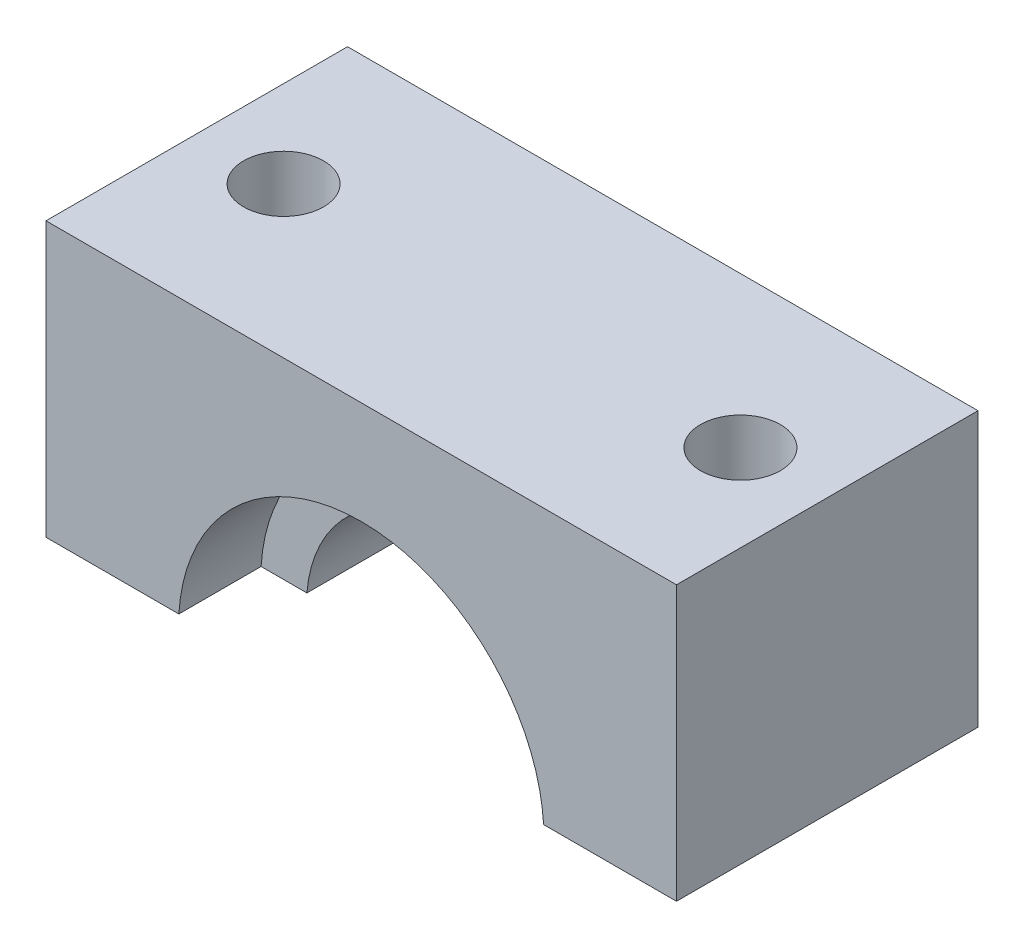
ISO-10303-21;
HEADER;
FILE_DESCRIPTION(('STEP AP214'),'2;1');
FILE_NAME('part.step','',(''),(''),'','','');
FILE_SCHEMA(('AUTOMOTIVE_DESIGN { 1 0 10303 214 1 1 1 1 }'));
ENDSEC;
DATA;
#1=APPLICATION_CONTEXT('core data for automotive mechanical design processes');
#2=APPLICATION_PROTOCOL_DEFINITION('international standard','automotive_design',2000,#1);
#3=PRODUCT_CONTEXT('',#1,'mechanical');
#4=PRODUCT('Part','Part','',(#3));
#5=PRODUCT_RELATED_PRODUCT_CATEGORY('part','',(#4));
#6=PRODUCT_DEFINITION_FORMATION('','',#4);
#7=PRODUCT_DEFINITION_CONTEXT('part definition',#1,'design');
#8=PRODUCT_DEFINITION('design','',#6,#7);
#9=PRODUCT_DEFINITION_SHAPE('','',#8);
#10=(LENGTH_UNIT() NAMED_UNIT(*) SI_UNIT(.MILLI.,.METRE.));
#11=(NAMED_UNIT(*) PLANE_ANGLE_UNIT() SI_UNIT($,.RADIAN.));
#12=(NAMED_UNIT(*) SI_UNIT($,.STERADIAN.) SOLID_ANGLE_UNIT());
#13=UNCERTAINTY_MEASURE_WITH_UNIT(LENGTH_MEASURE(1.E-05),#10,'distance_accuracy_value','');
#14=(GEOMETRIC_REPRESENTATION_CONTEXT(3) GLOBAL_UNCERTAINTY_ASSIGNED_CONTEXT((#13)) GLOBAL_UNIT_ASSIGNED_CONTEXT((#10,
#11,#12)) REPRESENTATION_CONTEXT('',''));
#15=CARTESIAN_POINT('',(0.,0.,0.));
#16=DIRECTION('',(0.,0.,1.));
#17=DIRECTION('',(1.,0.,0.));
#18=AXIS2_PLACEMENT_3D('',#15,#16,#17);
#19=CARTESIAN_POINT('',(0.,-6.5,3.));
#20=DIRECTION('',(0.,0.,1.));
#21=DIRECTION('',(1.,0.,0.));
#22=AXIS2_PLACEMENT_3D('',#19,#20,#21);
#23=PLANE('',#22);
#24=DIRECTION('',(1.,0.,0.));
#25=VECTOR('',#24,1.);
#26=CARTESIAN_POINT('',(5.9791303715507,-6.,3.));
#27=LINE('',#26,#25);
#28=CARTESIAN_POINT('',(5.9791303715507,-6.,3.));
#29=VERTEX_POINT('',#28);
#30=CARTESIAN_POINT('',(7.98435971133565,-6.,3.));
#31=VERTEX_POINT('',#30);
#32=EDGE_CURVE('E53',#29,#31,#27,.T.);
#33=ORIENTED_EDGE('',*,*,#32,.T.);
#34=CARTESIAN_POINT('',(0.,-6.5,3.));
#35=DIRECTION('',(0.,0.,1.));
#36=DIRECTION('',(1.,0.,0.));
#37=AXIS2_PLACEMENT_3D('',#34,#35,#36);
#38=CIRCLE('',#37,8.);
#39=CARTESIAN_POINT('',(-7.98435971133565,-6.,3.));
#40=VERTEX_POINT('',#39);
#41=EDGE_CURVE('E48',#31,#40,#38,.T.);
#42=ORIENTED_EDGE('',*,*,#41,.T.);
#43=DIRECTION('',(1.,0.,0.));
#44=VECTOR('',#43,1.);
#45=CARTESIAN_POINT('',(-13.8,-6.,3.));
#46=LINE('',#45,#44);
#47=CARTESIAN_POINT('',(-5.9791303715507,-6.,3.));
#48=VERTEX_POINT('',#47);
#49=EDGE_CURVE('E173',#40,#48,#46,.T.);
#50=ORIENTED_EDGE('',*,*,#49,.T.);
#51=CARTESIAN_POINT('',(0.,-6.5,3.));
#52=DIRECTION('',(0.,0.,-1.));
#53=DIRECTION('',(1.,0.,0.));
#54=AXIS2_PLACEMENT_3D('',#51,#52,#53);
#55=CIRCLE('',#54,6.);
#56=EDGE_CURVE('E169',#48,#29,#55,.T.);
#57=ORIENTED_EDGE('',*,*,#56,.T.);
#58=EDGE_LOOP('',(#33,#42,#50,#57));
#59=FACE_BOUND('',#58,.T.);
#60=ADVANCED_FACE('F33',(#59),#23,.T.);
#61=CARTESIAN_POINT('',(0.,-6.5,-3.));
#62=DIRECTION('',(0.,0.,1.));
#63=DIRECTION('',(1.,0.,0.));
#64=AXIS2_PLACEMENT_3D('',#61,#62,#63);
#65=PLANE('',#64);
#66=CARTESIAN_POINT('',(0.,-6.5,-3.));
#67=DIRECTION('',(0.,0.,1.));
#68=DIRECTION('',(1.,0.,0.));
#69=AXIS2_PLACEMENT_3D('',#66,#67,#68);
#70=CIRCLE('',#69,8.);
#71=CARTESIAN_POINT('',(7.98435971133565,-6.,-3.));
#72=VERTEX_POINT('',#71);
#73=CARTESIAN_POINT('',(-7.98435971133565,-6.,-3.));
#74=VERTEX_POINT('',#73);
#75=EDGE_CURVE('E11',#72,#74,#70,.T.);
#76=ORIENTED_EDGE('',*,*,#75,.F.);
#77=DIRECTION('',(1.,0.,0.));
#78=VECTOR('',#77,1.);
#79=CARTESIAN_POINT('',(5.9791303715507,-6.,-3.));
#80=LINE('',#79,#78);
#81=CARTESIAN_POINT('',(5.9791303715507,-6.,-3.));
#82=VERTEX_POINT('',#81);
#83=EDGE_CURVE('E178',#82,#72,#80,.T.);
#84=ORIENTED_EDGE('',*,*,#83,.F.);
#85=CARTESIAN_POINT('',(0.,-6.5,-3.));
#86=DIRECTION('',(0.,0.,-1.));
#87=DIRECTION('',(1.,0.,0.));
#88=AXIS2_PLACEMENT_3D('',#85,#86,#87);
#89=CIRCLE('',#88,6.);
#90=CARTESIAN_POINT('',(-5.9791303715507,-6.,-3.));
#91=VERTEX_POINT('',#90);
#92=EDGE_CURVE('E168',#91,#82,#89,.T.);
#93=ORIENTED_EDGE('',*,*,#92,.F.);
#94=DIRECTION('',(1.,0.,0.));
#95=VECTOR('',#94,1.);
#96=CARTESIAN_POINT('',(-13.8,-6.,-3.));
#97=LINE('',#96,#95);
#98=EDGE_CURVE('E171',#74,#91,#97,.T.);
#99=ORIENTED_EDGE('',*,*,#98,.F.);
#100=EDGE_LOOP('',(#76,#84,#93,#99));
#101=FACE_BOUND('',#100,.T.);
#102=ADVANCED_FACE('F198',(#101),#65,.F.);
#103=CARTESIAN_POINT('',(0.,-6.5,3.));
#104=DIRECTION('',(0.,0.,-1.));
#105=DIRECTION('',(-1.,0.,0.));
#106=AXIS2_PLACEMENT_3D('',#103,#104,#105);
#107=CYLINDRICAL_SURFACE('',#106,6.);
#108=ORIENTED_EDGE('',*,*,#92,.T.);
#109=DIRECTION('',(0.,0.,-1.));
#110=VECTOR('',#109,1.);
#111=CARTESIAN_POINT('',(5.9791303715507,-6.,3.));
#112=LINE('',#111,#110);
#113=EDGE_CURVE('E41',#29,#82,#112,.T.);
#114=ORIENTED_EDGE('',*,*,#113,.F.);
#115=ORIENTED_EDGE('',*,*,#56,.F.);
#116=DIRECTION('',(0.,0.,-1.));
#117=VECTOR('',#116,1.);
#118=CARTESIAN_POINT('',(-5.9791303715507,-6.,3.));
#119=LINE('',#118,#117);
#120=EDGE_CURVE('E175',#48,#91,#119,.T.);
#121=ORIENTED_EDGE('',*,*,#120,.T.);
#122=EDGE_LOOP('',(#108,#114,#115,#121));
#123=FACE_BOUND('',#122,.T.);
#124=ADVANCED_FACE('F35',(#123),#107,.F.);
#125=CARTESIAN_POINT('',(5.9791303715507,-6.,3.));
#126=DIRECTION('',(0.,1.,0.));
#127=DIRECTION('',(-1.,0.,0.));
#128=AXIS2_PLACEMENT_3D('',#125,#126,#127);
#129=PLANE('',#128);
#130=CARTESIAN_POINT('',(10.,-5.99999999999999,0.));
#131=DIRECTION('',(0.,-1.,0.));
#132=DIRECTION('',(1.,0.,0.));
#133=AXIS2_PLACEMENT_3D('',#130,#131,#132);
#134=CIRCLE('',#133,1.75);
#135=CARTESIAN_POINT('',(11.75,-5.99999999999999,0.));
#136=VERTEX_POINT('',#135);
#137=EDGE_CURVE('E243',#136,#136,#134,.T.);
#138=ORIENTED_EDGE('',*,*,#137,.F.);
#139=EDGE_LOOP('',(#138));
#140=FACE_BOUND('',#139,.T.);
#141=DIRECTION('',(0.,0.,-1.));
#142=VECTOR('',#141,1.);
#143=CARTESIAN_POINT('',(13.8,-5.99999999999999,3.));
#144=LINE('',#143,#142);
#145=CARTESIAN_POINT('',(13.8,-5.99999999999999,6.6));
#146=VERTEX_POINT('',#145);
#147=CARTESIAN_POINT('',(13.8,-5.99999999999999,-6.6));
#148=VERTEX_POINT('',#147);
#149=EDGE_CURVE('E117',#146,#148,#144,.T.);
#150=ORIENTED_EDGE('',*,*,#149,.F.);
#151=DIRECTION('',(1.,0.,0.));
#152=VECTOR('',#151,1.);
#153=CARTESIAN_POINT('',(13.8,-5.99999999999999,6.6));
#154=LINE('',#153,#152);
#155=CARTESIAN_POINT('',(7.98435971133565,-6.,6.6));
#156=VERTEX_POINT('',#155);
#157=EDGE_CURVE('E131',#156,#146,#154,.T.);
#158=ORIENTED_EDGE('',*,*,#157,.F.);
#159=DIRECTION('',(0.,0.,-1.));
#160=VECTOR('',#159,1.);
#161=CARTESIAN_POINT('',(7.98435971133565,-6.,6.6));
#162=LINE('',#161,#160);
#163=EDGE_CURVE('E160',#156,#31,#162,.T.);
#164=ORIENTED_EDGE('',*,*,#163,.T.);
#165=ORIENTED_EDGE('',*,*,#32,.F.);
#166=ORIENTED_EDGE('',*,*,#113,.T.);
#167=ORIENTED_EDGE('',*,*,#83,.T.);
#168=CARTESIAN_POINT('',(7.98435971133565,-6.,-6.6));
#169=VERTEX_POINT('',#168);
#170=EDGE_CURVE('E147',#72,#169,#162,.T.);
#171=ORIENTED_EDGE('',*,*,#170,.T.);
#172=DIRECTION('',(1.,0.,0.));
#173=VECTOR('',#172,1.);
#174=CARTESIAN_POINT('',(13.8,-5.99999999999999,-6.6));
#175=LINE('',#174,#173);
#176=EDGE_CURVE('E132',#169,#148,#175,.T.);
#177=ORIENTED_EDGE('',*,*,#176,.T.);
#178=EDGE_LOOP('',(#150,#158,#164,#165,#166,#167,#171,#177));
#179=FACE_BOUND('',#178,.T.);
#180=ADVANCED_FACE('F190',(#140,#179),#129,.F.);
#181=CARTESIAN_POINT('',(13.8,6.00000000000001,3.));
#182=DIRECTION('',(-1.,0.,0.));
#183=DIRECTION('',(0.,-1.,0.));
#184=AXIS2_PLACEMENT_3D('',#181,#182,#183);
#185=PLANE('',#184);
#186=ORIENTED_EDGE('',*,*,#149,.T.);
#187=DIRECTION('',(0.,1.,0.));
#188=VECTOR('',#187,1.);
#189=CARTESIAN_POINT('',(13.8,-5.99999999999999,-6.6));
#190=LINE('',#189,#188);
#191=CARTESIAN_POINT('',(13.8,6.00000000000001,-6.6));
#192=VERTEX_POINT('',#191);
#193=EDGE_CURVE('E113',#148,#192,#190,.T.);
#194=ORIENTED_EDGE('',*,*,#193,.T.);
#195=DIRECTION('',(0.,0.,-1.));
#196=VECTOR('',#195,1.);
#197=CARTESIAN_POINT('',(13.8,6.00000000000001,3.));
#198=LINE('',#197,#196);
#199=CARTESIAN_POINT('',(13.8,6.00000000000001,6.6));
#200=VERTEX_POINT('',#199);
#201=EDGE_CURVE('E107',#200,#192,#198,.T.);
#202=ORIENTED_EDGE('',*,*,#201,.F.);
#203=DIRECTION('',(0.,1.,0.));
#204=VECTOR('',#203,1.);
#205=CARTESIAN_POINT('',(13.8,-5.99999999999999,6.6));
#206=LINE('',#205,#204);
#207=EDGE_CURVE('E111',#146,#200,#206,.T.);
#208=ORIENTED_EDGE('',*,*,#207,.F.);
#209=EDGE_LOOP('',(#186,#194,#202,#208));
#210=FACE_BOUND('',#209,.T.);
#211=ADVANCED_FACE('F109',(#210),#185,.F.);
#212=CARTESIAN_POINT('',(-13.8,6.,3.));
#213=DIRECTION('',(0.,-1.,0.));
#214=DIRECTION('',(1.,0.,0.));
#215=AXIS2_PLACEMENT_3D('',#212,#213,#214);
#216=PLANE('',#215);
#217=CARTESIAN_POINT('',(10.,6.00000000000001,0.));
#218=DIRECTION('',(0.,-1.,0.));
#219=DIRECTION('',(1.,0.,0.));
#220=AXIS2_PLACEMENT_3D('',#217,#218,#219);
#221=CIRCLE('',#220,1.75);
#222=CARTESIAN_POINT('',(11.75,6.00000000000001,0.));
#223=VERTEX_POINT('',#222);
#224=EDGE_CURVE('E245',#223,#223,#221,.T.);
#225=ORIENTED_EDGE('',*,*,#224,.T.);
#226=EDGE_LOOP('',(#225));
#227=FACE_BOUND('',#226,.T.);
#228=CARTESIAN_POINT('',(-10.,6.00000000000001,0.));
#229=DIRECTION('',(0.,-1.,0.));
#230=DIRECTION('',(1.,0.,0.));
#231=AXIS2_PLACEMENT_3D('',#228,#229,#230);
#232=CIRCLE('',#231,1.75);
#233=CARTESIAN_POINT('',(-8.25,6.00000000000001,0.));
#234=VERTEX_POINT('',#233);
#235=EDGE_CURVE('E150',#234,#234,#232,.T.);
#236=ORIENTED_EDGE('',*,*,#235,.T.);
#237=EDGE_LOOP('',(#236));
#238=FACE_BOUND('',#237,.T.);
#239=ORIENTED_EDGE('',*,*,#201,.T.);
#240=DIRECTION('',(-1.,0.,0.));
#241=VECTOR('',#240,1.);
#242=CARTESIAN_POINT('',(13.8,6.00000000000001,-6.6));
#243=LINE('',#242,#241);
#244=CARTESIAN_POINT('',(-13.8,6.,-6.6));
#245=VERTEX_POINT('',#244);
#246=EDGE_CURVE('E149',#192,#245,#243,.T.);
#247=ORIENTED_EDGE('',*,*,#246,.T.);
#248=DIRECTION('',(0.,0.,-1.));
#249=VECTOR('',#248,1.);
#250=CARTESIAN_POINT('',(-13.8,6.,3.));
#251=LINE('',#250,#249);
#252=CARTESIAN_POINT('',(-13.8,6.,6.6));
#253=VERTEX_POINT('',#252);
#254=EDGE_CURVE('E118',#253,#245,#251,.T.);
#255=ORIENTED_EDGE('',*,*,#254,.F.);
#256=DIRECTION('',(-1.,0.,0.));
#257=VECTOR('',#256,1.);
#258=CARTESIAN_POINT('',(13.8,6.00000000000001,6.6));
#259=LINE('',#258,#257);
#260=EDGE_CURVE('E121',#200,#253,#259,.T.);
#261=ORIENTED_EDGE('',*,*,#260,.F.);
#262=EDGE_LOOP('',(#239,#247,#255,#261));
#263=FACE_BOUND('',#262,.T.);
#264=ADVANCED_FACE('F122',(#227,#238,#263),#216,.F.);
#265=CARTESIAN_POINT('',(-13.8,6.,3.));
#266=DIRECTION('',(1.,0.,0.));
#267=DIRECTION('',(0.,1.,0.));
#268=AXIS2_PLACEMENT_3D('',#265,#266,#267);
#269=PLANE('',#268);
#270=ORIENTED_EDGE('',*,*,#254,.T.);
#271=DIRECTION('',(0.,-1.,0.));
#272=VECTOR('',#271,1.);
#273=CARTESIAN_POINT('',(-13.8,6.,-6.6));
#274=LINE('',#273,#272);
#275=CARTESIAN_POINT('',(-13.8,-6.,-6.6));
#276=VERTEX_POINT('',#275);
#277=EDGE_CURVE('E152',#245,#276,#274,.T.);
#278=ORIENTED_EDGE('',*,*,#277,.T.);
#279=DIRECTION('',(0.,0.,-1.));
#280=VECTOR('',#279,1.);
#281=CARTESIAN_POINT('',(-13.8,-6.,3.));
#282=LINE('',#281,#280);
#283=CARTESIAN_POINT('',(-13.8,-6.,6.6));
#284=VERTEX_POINT('',#283);
#285=EDGE_CURVE('E184',#284,#276,#282,.T.);
#286=ORIENTED_EDGE('',*,*,#285,.F.);
#287=DIRECTION('',(0.,-1.,0.));
#288=VECTOR('',#287,1.);
#289=CARTESIAN_POINT('',(-13.8,6.,6.6));
#290=LINE('',#289,#288);
#291=EDGE_CURVE('E126',#253,#284,#290,.T.);
#292=ORIENTED_EDGE('',*,*,#291,.F.);
#293=EDGE_LOOP('',(#270,#278,#286,#292));
#294=FACE_BOUND('',#293,.T.);
#295=ADVANCED_FACE('F227',(#294),#269,.F.);
#296=CARTESIAN_POINT('',(-13.8,-6.,3.));
#297=DIRECTION('',(0.,1.,0.));
#298=DIRECTION('',(-1.,0.,0.));
#299=AXIS2_PLACEMENT_3D('',#296,#297,#298);
#300=PLANE('',#299);
#301=CARTESIAN_POINT('',(-10.,-6.,0.));
#302=DIRECTION('',(0.,-1.,0.));
#303=DIRECTION('',(1.,0.,0.));
#304=AXIS2_PLACEMENT_3D('',#301,#302,#303);
#305=CIRCLE('',#304,1.75);
#306=CARTESIAN_POINT('',(-8.25,-6.,0.));
#307=VERTEX_POINT('',#306);
#308=EDGE_CURVE('E138',#307,#307,#305,.T.);
#309=ORIENTED_EDGE('',*,*,#308,.F.);
#310=EDGE_LOOP('',(#309));
#311=FACE_BOUND('',#310,.T.);
#312=ORIENTED_EDGE('',*,*,#285,.T.);
#313=DIRECTION('',(1.,0.,0.));
#314=VECTOR('',#313,1.);
#315=CARTESIAN_POINT('',(-13.8,-6.,-6.6));
#316=LINE('',#315,#314);
#317=CARTESIAN_POINT('',(-7.98435971133565,-6.,-6.6));
#318=VERTEX_POINT('',#317);
#319=EDGE_CURVE('E155',#276,#318,#316,.T.);
#320=ORIENTED_EDGE('',*,*,#319,.T.);
#321=DIRECTION('',(0.,0.,-1.));
#322=VECTOR('',#321,1.);
#323=CARTESIAN_POINT('',(-7.98435971133565,-6.,6.6));
#324=LINE('',#323,#322);
#325=EDGE_CURVE('E163',#74,#318,#324,.T.);
#326=ORIENTED_EDGE('',*,*,#325,.F.);
#327=ORIENTED_EDGE('',*,*,#98,.T.);
#328=ORIENTED_EDGE('',*,*,#120,.F.);
#329=ORIENTED_EDGE('',*,*,#49,.F.);
#330=CARTESIAN_POINT('',(-7.98435971133565,-6.,6.6));
#331=VERTEX_POINT('',#330);
#332=EDGE_CURVE('E164',#331,#40,#324,.T.);
#333=ORIENTED_EDGE('',*,*,#332,.F.);
#334=DIRECTION('',(1.,0.,0.));
#335=VECTOR('',#334,1.);
#336=CARTESIAN_POINT('',(-13.8,-6.,6.6));
#337=LINE('',#336,#335);
#338=EDGE_CURVE('E142',#284,#331,#337,.T.);
#339=ORIENTED_EDGE('',*,*,#338,.F.);
#340=EDGE_LOOP('',(#312,#320,#326,#327,#328,#329,#333,#339));
#341=FACE_BOUND('',#340,.T.);
#342=ADVANCED_FACE('F203',(#311,#341),#300,.F.);
#343=CARTESIAN_POINT('',(0.,-6.5,-6.6));
#344=DIRECTION('',(0.,0.,-1.));
#345=DIRECTION('',(-1.,0.,0.));
#346=AXIS2_PLACEMENT_3D('',#343,#344,#345);
#347=PLANE('',#346);
#348=ORIENTED_EDGE('',*,*,#193,.F.);
#349=ORIENTED_EDGE('',*,*,#176,.F.);
#350=CARTESIAN_POINT('',(0.,-6.5,-6.6));
#351=DIRECTION('',(0.,0.,-1.));
#352=DIRECTION('',(-1.,0.,0.));
#353=AXIS2_PLACEMENT_3D('',#350,#351,#352);
#354=CIRCLE('',#353,8.);
#355=EDGE_CURVE('E135',#318,#169,#354,.T.);
#356=ORIENTED_EDGE('',*,*,#355,.F.);
#357=ORIENTED_EDGE('',*,*,#319,.F.);
#358=ORIENTED_EDGE('',*,*,#277,.F.);
#359=ORIENTED_EDGE('',*,*,#246,.F.);
#360=EDGE_LOOP('',(#348,#349,#356,#357,#358,#359));
#361=FACE_BOUND('',#360,.T.);
#362=ADVANCED_FACE('F210',(#361),#347,.T.);
#363=CARTESIAN_POINT('',(0.,-6.5,6.6));
#364=DIRECTION('',(0.,0.,-1.));
#365=DIRECTION('',(-1.,0.,0.));
#366=AXIS2_PLACEMENT_3D('',#363,#364,#365);
#367=CYLINDRICAL_SURFACE('',#366,8.);
#368=ORIENTED_EDGE('',*,*,#170,.F.);
#369=ORIENTED_EDGE('',*,*,#75,.T.);
#370=ORIENTED_EDGE('',*,*,#325,.T.);
#371=ORIENTED_EDGE('',*,*,#355,.T.);
#372=EDGE_LOOP('',(#368,#369,#370,#371));
#373=FACE_BOUND('',#372,.T.);
#374=ADVANCED_FACE('F201',(#373),#367,.F.);
#375=ORIENTED_EDGE('',*,*,#41,.F.);
#376=ORIENTED_EDGE('',*,*,#163,.F.);
#377=CARTESIAN_POINT('',(0.,-6.5,6.6));
#378=DIRECTION('',(0.,0.,-1.));
#379=DIRECTION('',(-1.,0.,0.));
#380=AXIS2_PLACEMENT_3D('',#377,#378,#379);
#381=CIRCLE('',#380,8.);
#382=EDGE_CURVE('E144',#331,#156,#381,.T.);
#383=ORIENTED_EDGE('',*,*,#382,.F.);
#384=ORIENTED_EDGE('',*,*,#332,.T.);
#385=EDGE_LOOP('',(#375,#376,#383,#384));
#386=FACE_BOUND('',#385,.T.);
#387=ADVANCED_FACE('F214',(#386),#367,.F.);
#388=CARTESIAN_POINT('',(0.,-6.5,6.6));
#389=DIRECTION('',(0.,0.,-1.));
#390=DIRECTION('',(-1.,0.,0.));
#391=AXIS2_PLACEMENT_3D('',#388,#389,#390);
#392=PLANE('',#391);
#393=ORIENTED_EDGE('',*,*,#207,.T.);
#394=ORIENTED_EDGE('',*,*,#260,.T.);
#395=ORIENTED_EDGE('',*,*,#291,.T.);
#396=ORIENTED_EDGE('',*,*,#338,.T.);
#397=ORIENTED_EDGE('',*,*,#382,.T.);
#398=ORIENTED_EDGE('',*,*,#157,.T.);
#399=EDGE_LOOP('',(#393,#394,#395,#396,#397,#398));
#400=FACE_BOUND('',#399,.T.);
#401=ADVANCED_FACE('F129',(#400),#392,.F.);
#402=CARTESIAN_POINT('',(-10.,6.00000000000001,0.));
#403=DIRECTION('',(0.,-1.,0.));
#404=DIRECTION('',(1.,0.,0.));
#405=AXIS2_PLACEMENT_3D('',#402,#403,#404);
#406=CYLINDRICAL_SURFACE('',#405,1.75);
#407=ORIENTED_EDGE('',*,*,#235,.F.);
#408=EDGE_LOOP('',(#407));
#409=FACE_BOUND('',#408,.T.);
#410=ORIENTED_EDGE('',*,*,#308,.T.);
#411=EDGE_LOOP('',(#410));
#412=FACE_BOUND('',#411,.T.);
#413=ADVANCED_FACE('F255',(#409,#412),#406,.F.);
#414=CARTESIAN_POINT('',(10.,6.00000000000001,0.));
#415=DIRECTION('',(0.,-1.,0.));
#416=DIRECTION('',(1.,0.,0.));
#417=AXIS2_PLACEMENT_3D('',#414,#415,#416);
#418=CYLINDRICAL_SURFACE('',#417,1.75);
#419=ORIENTED_EDGE('',*,*,#224,.F.);
#420=EDGE_LOOP('',(#419));
#421=FACE_BOUND('',#420,.T.);
#422=ORIENTED_EDGE('',*,*,#137,.T.);
#423=EDGE_LOOP('',(#422));
#424=FACE_BOUND('',#423,.T.);
#425=ADVANCED_FACE('F257',(#421,#424),#418,.F.);
#426=CLOSED_SHELL('',(#60,#102,#124,#180,#211,#264,#295,#342,#362,#374,#387,#401,#413,#425));
#427=MANIFOLD_SOLID_BREP('B2',#426);
#428=ADVANCED_BREP_SHAPE_REPRESENTATION('',(#18,#427),#14);
#429=SHAPE_DEFINITION_REPRESENTATION(#9,#428);
ENDSEC;
END-ISO-10303-21;
